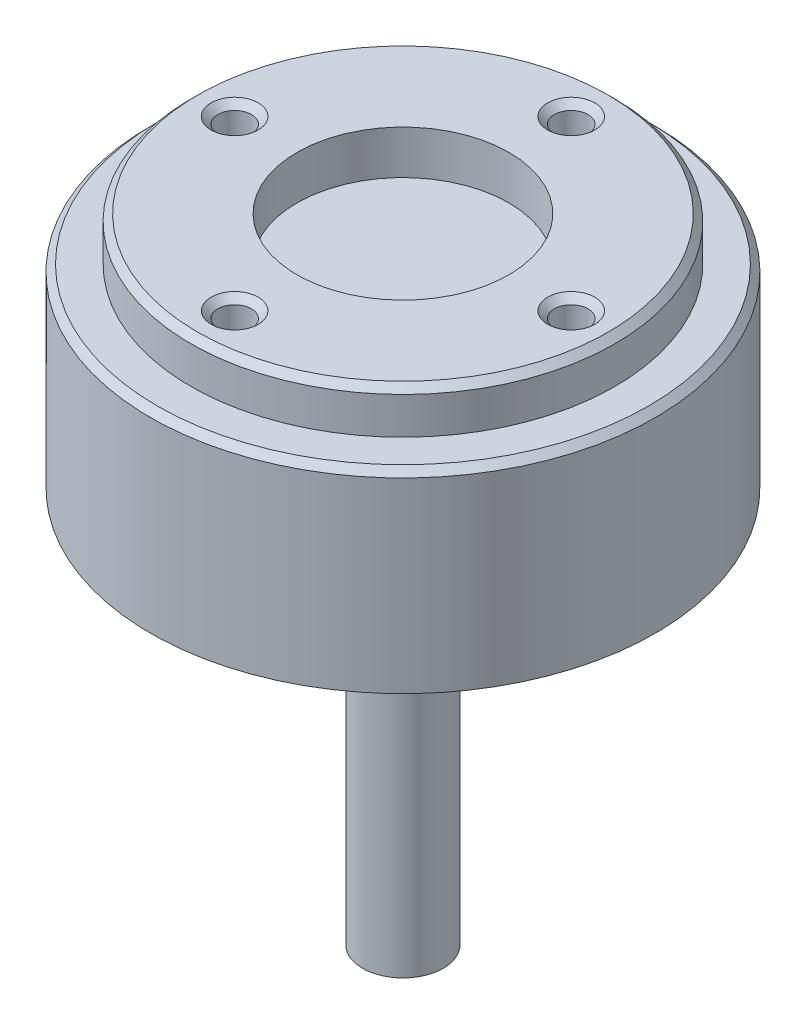
ISO-10303-21;
HEADER;
FILE_DESCRIPTION(('STEP AP214'),'2;1');
FILE_NAME('part.step','',(''),(''),'','','');
FILE_SCHEMA(('AUTOMOTIVE_DESIGN { 1 0 10303 214 1 1 1 1 }'));
ENDSEC;
DATA;
#1=APPLICATION_CONTEXT('core data for automotive mechanical design processes');
#2=APPLICATION_PROTOCOL_DEFINITION('international standard','automotive_design',2000,#1);
#3=PRODUCT_CONTEXT('',#1,'mechanical');
#4=PRODUCT('Part','Part','',(#3));
#5=PRODUCT_RELATED_PRODUCT_CATEGORY('part','',(#4));
#6=PRODUCT_DEFINITION_FORMATION('','',#4);
#7=PRODUCT_DEFINITION_CONTEXT('part definition',#1,'design');
#8=PRODUCT_DEFINITION('design','',#6,#7);
#9=PRODUCT_DEFINITION_SHAPE('','',#8);
#10=(LENGTH_UNIT() NAMED_UNIT(*) SI_UNIT(.MILLI.,.METRE.));
#11=(NAMED_UNIT(*) PLANE_ANGLE_UNIT() SI_UNIT($,.RADIAN.));
#12=(NAMED_UNIT(*) SI_UNIT($,.STERADIAN.) SOLID_ANGLE_UNIT());
#13=UNCERTAINTY_MEASURE_WITH_UNIT(LENGTH_MEASURE(1.E-05),#10,'distance_accuracy_value','');
#14=(GEOMETRIC_REPRESENTATION_CONTEXT(3) GLOBAL_UNCERTAINTY_ASSIGNED_CONTEXT((#13)) GLOBAL_UNIT_ASSIGNED_CONTEXT((#10,
#11,#12)) REPRESENTATION_CONTEXT('',''));
#15=CARTESIAN_POINT('',(0.,0.,0.));
#16=DIRECTION('',(0.,0.,1.));
#17=DIRECTION('',(1.,0.,0.));
#18=AXIS2_PLACEMENT_3D('',#15,#16,#17);
#19=CARTESIAN_POINT('',(0.,28.75,0.));
#20=DIRECTION('',(0.,-1.,0.));
#21=DIRECTION('',(0.,0.,-1.));
#22=AXIS2_PLACEMENT_3D('',#19,#20,#21);
#23=CYLINDRICAL_SURFACE('',#22,37.5);
#24=CARTESIAN_POINT('',(0.,27.7500000000001,0.));
#25=DIRECTION('',(0.,1.,0.));
#26=DIRECTION('',(0.,0.,1.));
#27=AXIS2_PLACEMENT_3D('',#24,#25,#26);
#28=CIRCLE('',#27,37.5);
#29=CARTESIAN_POINT('',(0.,27.7500000000001,-37.5));
#30=VERTEX_POINT('',#29);
#31=EDGE_CURVE('E90',#30,#30,#28,.F.);
#32=CARTESIAN_POINT('',(0.,0.,0.));
#33=DIRECTION('',(0.,1.,0.));
#34=DIRECTION('',(0.,0.,1.));
#35=AXIS2_PLACEMENT_3D('',#32,#33,#34);
#36=CIRCLE('',#35,37.5);
#37=CARTESIAN_POINT('',(0.,0.,-37.5));
#38=VERTEX_POINT('',#37);
#39=EDGE_CURVE('E120',#38,#38,#36,.T.);
#40=CARTESIAN_POINT('',(0.,27.7500000000001,-37.5));
#41=CARTESIAN_POINT('',(0.,27.4609375000001,-37.5));
#42=CARTESIAN_POINT('',(0.,27.1718750000001,-37.5));
#43=CARTESIAN_POINT('',(0.,26.5937500000001,-37.5));
#44=CARTESIAN_POINT('',(0.,26.3046875000001,-37.5));
#45=CARTESIAN_POINT('',(0.,25.7265625000001,-37.5));
#46=CARTESIAN_POINT('',(0.,25.4375000000001,-37.5));
#47=CARTESIAN_POINT('',(0.,24.8593750000001,-37.5));
#48=CARTESIAN_POINT('',(0.,24.5703125000001,-37.5));
#49=CARTESIAN_POINT('',(0.,23.9921875000001,-37.5));
#50=CARTESIAN_POINT('',(0.,23.7031250000001,-37.5));
#51=CARTESIAN_POINT('',(0.,23.1250000000001,-37.5));
#52=CARTESIAN_POINT('',(0.,22.8359375000001,-37.5));
#53=CARTESIAN_POINT('',(0.,22.2578125000001,-37.5));
#54=CARTESIAN_POINT('',(0.,21.9687500000001,-37.5));
#55=CARTESIAN_POINT('',(0.,21.3906250000001,-37.5));
#56=CARTESIAN_POINT('',(0.,21.1015625000001,-37.5));
#57=CARTESIAN_POINT('',(0.,20.5234375000001,-37.5));
#58=CARTESIAN_POINT('',(0.,20.2343750000001,-37.5));
#59=CARTESIAN_POINT('',(0.,19.6562500000001,-37.5));
#60=CARTESIAN_POINT('',(0.,19.3671875000001,-37.5));
#61=CARTESIAN_POINT('',(0.,18.7890625000001,-37.5));
#62=CARTESIAN_POINT('',(0.,18.5,-37.5));
#63=CARTESIAN_POINT('',(0.,17.921875,-37.5));
#64=CARTESIAN_POINT('',(0.,17.6328125,-37.5));
#65=CARTESIAN_POINT('',(0.,17.0546875,-37.5));
#66=CARTESIAN_POINT('',(0.,16.765625,-37.5));
#67=CARTESIAN_POINT('',(0.,16.1875,-37.5));
#68=CARTESIAN_POINT('',(0.,15.8984375,-37.5));
#69=CARTESIAN_POINT('',(0.,15.3203125,-37.5));
#70=CARTESIAN_POINT('',(0.,15.03125,-37.5));
#71=CARTESIAN_POINT('',(0.,14.453125,-37.5));
#72=CARTESIAN_POINT('',(0.,14.1640625,-37.5));
#73=CARTESIAN_POINT('',(0.,13.5859375,-37.5));
#74=CARTESIAN_POINT('',(0.,13.296875,-37.5));
#75=CARTESIAN_POINT('',(0.,12.71875,-37.5));
#76=CARTESIAN_POINT('',(0.,12.4296875,-37.5));
#77=CARTESIAN_POINT('',(0.,11.8515625,-37.5));
#78=CARTESIAN_POINT('',(0.,11.5625,-37.5));
#79=CARTESIAN_POINT('',(0.,10.984375,-37.5));
#80=CARTESIAN_POINT('',(0.,10.6953125,-37.5));
#81=CARTESIAN_POINT('',(0.,10.1171875,-37.5));
#82=CARTESIAN_POINT('',(0.,9.82812500000003,-37.5));
#83=CARTESIAN_POINT('',(0.,9.25000000000002,-37.5));
#84=CARTESIAN_POINT('',(0.,8.96093750000002,-37.5));
#85=CARTESIAN_POINT('',(0.,8.38281250000002,-37.5));
#86=CARTESIAN_POINT('',(0.,8.09375000000002,-37.5));
#87=CARTESIAN_POINT('',(0.,7.51562500000002,-37.5));
#88=CARTESIAN_POINT('',(0.,7.22656250000002,-37.5));
#89=CARTESIAN_POINT('',(0.,6.64843750000002,-37.5));
#90=CARTESIAN_POINT('',(0.,6.35937500000002,-37.5));
#91=CARTESIAN_POINT('',(0.,5.78125000000002,-37.5));
#92=CARTESIAN_POINT('',(0.,5.49218750000001,-37.5));
#93=CARTESIAN_POINT('',(0.,4.91406250000001,-37.5));
#94=CARTESIAN_POINT('',(0.,4.62500000000001,-37.5));
#95=CARTESIAN_POINT('',(0.,4.04687500000001,-37.5));
#96=CARTESIAN_POINT('',(0.,3.75781250000001,-37.5));
#97=CARTESIAN_POINT('',(0.,3.17968750000001,-37.5));
#98=CARTESIAN_POINT('',(0.,2.89062500000001,-37.5));
#99=CARTESIAN_POINT('',(0.,2.3125,-37.5));
#100=CARTESIAN_POINT('',(0.,2.0234375,-37.5));
#101=CARTESIAN_POINT('',(0.,1.4453125,-37.5));
#102=CARTESIAN_POINT('',(0.,1.15625,-37.5));
#103=CARTESIAN_POINT('',(0.,0.578124999999998,-37.5));
#104=CARTESIAN_POINT('',(0.,0.289062499999997,-37.5));
#105=CARTESIAN_POINT('',(0.,0.,-37.5));
#106=B_SPLINE_CURVE_WITH_KNOTS('',3,(#40,#41,#42,#43,#44,#45,#46,#47,#48,#49,#50,#51,#52,#53,
#54,#55,#56,#57,#58,#59,#60,#61,#62,#63,#64,#65,#66,#67,#68,#69,#70,#71,#72,#73,#74,#75,#76,#77,
#78,#79,#80,#81,#82,#83,#84,#85,#86,#87,#88,#89,#90,#91,#92,#93,#94,#95,#96,#97,#98,#99,#100,
#101,#102,#103,#104,#105),.UNSPECIFIED.,.F.,.F.,(4,2,2,2,2,2,2,2,2,2,2,2,2,2,2,2,2,2,2,2,2,2,2,
2,2,2,2,2,2,2,2,2,4),(0.,0.867187500000002,1.734375,2.6015625,3.46875000000001,4.33593750000001,
5.20312500000001,6.07031250000002,6.93750000000002,7.80468750000002,8.67187500000002,
9.53906250000002,10.40625,11.2734375,12.140625,13.0078125,13.875,14.7421875,15.609375,
16.4765625,17.34375,18.2109375000001,19.0781250000001,19.9453125000001,20.8125000000001,
21.6796875000001,22.5468750000001,23.4140625000001,24.2812500000001,25.1484375000001,
26.0156250000001,26.8828125000001,27.7500000000001),.UNSPECIFIED.);
#107=EDGE_CURVE('BSEAM49',#30,#38,#106,.T.);
#108=ORIENTED_EDGE('',*,*,#31,.T.);
#109=ORIENTED_EDGE('',*,*,#39,.T.);
#110=ORIENTED_EDGE('',*,*,#107,.T.);
#111=ORIENTED_EDGE('',*,*,#107,.F.);
#112=EDGE_LOOP('',(#108,#110,#109,#111));
#113=FACE_BOUND('',#112,.T.);
#114=ADVANCED_FACE('F49',(#113),#23,.T.);
#115=CARTESIAN_POINT('',(0.,28.75,0.));
#116=DIRECTION('',(0.,1.,0.));
#117=DIRECTION('',(0.,0.,1.));
#118=AXIS2_PLACEMENT_3D('',#115,#116,#117);
#119=PLANE('',#118);
#120=CARTESIAN_POINT('',(0.,28.75,0.));
#121=DIRECTION('',(0.,1.,0.));
#122=DIRECTION('',(0.,0.,1.));
#123=AXIS2_PLACEMENT_3D('',#120,#121,#122);
#124=CIRCLE('',#123,36.5000000000001);
#125=CARTESIAN_POINT('',(0.,28.75,36.5000000000001));
#126=VERTEX_POINT('',#125);
#127=EDGE_CURVE('E94',#126,#126,#124,.T.);
#128=ORIENTED_EDGE('',*,*,#127,.T.);
#129=EDGE_LOOP('',(#128));
#130=FACE_BOUND('',#129,.T.);
#131=CARTESIAN_POINT('',(0.,28.75,0.));
#132=DIRECTION('',(0.,1.,0.));
#133=DIRECTION('',(0.,0.,1.));
#134=AXIS2_PLACEMENT_3D('',#131,#132,#133);
#135=CIRCLE('',#134,31.5);
#136=CARTESIAN_POINT('',(0.,28.75,-31.5));
#137=VERTEX_POINT('',#136);
#138=EDGE_CURVE('E124',#137,#137,#135,.T.);
#139=ORIENTED_EDGE('',*,*,#138,.F.);
#140=EDGE_LOOP('',(#139));
#141=FACE_BOUND('',#140,.T.);
#142=ADVANCED_FACE('F174',(#130,#141),#119,.T.);
#143=CARTESIAN_POINT('',(0.,0.,0.));
#144=DIRECTION('',(0.,1.,0.));
#145=DIRECTION('',(0.,0.,1.));
#146=AXIS2_PLACEMENT_3D('',#143,#144,#145);
#147=PLANE('',#146);
#148=CARTESIAN_POINT('',(0.,0.,0.));
#149=DIRECTION('',(0.,1.,0.));
#150=DIRECTION('',(0.,0.,1.));
#151=AXIS2_PLACEMENT_3D('',#148,#149,#150);
#152=CIRCLE('',#151,7.5);
#153=CARTESIAN_POINT('',(0.,0.,7.5));
#154=VERTEX_POINT('',#153);
#155=EDGE_CURVE('E106',#154,#154,#152,.F.);
#156=ORIENTED_EDGE('',*,*,#155,.F.);
#157=EDGE_LOOP('',(#156));
#158=FACE_BOUND('',#157,.T.);
#159=ORIENTED_EDGE('',*,*,#39,.F.);
#160=EDGE_LOOP('',(#159));
#161=FACE_BOUND('',#160,.T.);
#162=ADVANCED_FACE('F181',(#158,#161),#147,.F.);
#163=CARTESIAN_POINT('',(0.,35.25,0.));
#164=DIRECTION('',(0.,1.,0.));
#165=DIRECTION('',(0.,0.,1.));
#166=AXIS2_PLACEMENT_3D('',#163,#164,#165);
#167=PLANE('',#166);
#168=CARTESIAN_POINT('',(25.,35.25,0.));
#169=DIRECTION('',(0.,1.,0.));
#170=DIRECTION('',(0.,0.,1.));
#171=AXIS2_PLACEMENT_3D('',#168,#169,#170);
#172=CIRCLE('',#171,3.50000000000002);
#173=CARTESIAN_POINT('',(25.,35.25,3.5000000000001));
#174=VERTEX_POINT('',#173);
#175=EDGE_CURVE('E68',#174,#174,#172,.F.);
#176=ORIENTED_EDGE('',*,*,#175,.T.);
#177=EDGE_LOOP('',(#176));
#178=FACE_BOUND('',#177,.T.);
#179=CARTESIAN_POINT('',(-1.74574066942157E-13,35.25,25.));
#180=DIRECTION('',(0.,1.,0.));
#181=DIRECTION('',(0.,0.,1.));
#182=AXIS2_PLACEMENT_3D('',#179,#180,#181);
#183=CIRCLE('',#182,3.50000000000002);
#184=CARTESIAN_POINT('',(-1.74574066942157E-13,35.25,28.5));
#185=VERTEX_POINT('',#184);
#186=EDGE_CURVE('E74',#185,#185,#183,.F.);
#187=ORIENTED_EDGE('',*,*,#186,.T.);
#188=EDGE_LOOP('',(#187));
#189=FACE_BOUND('',#188,.T.);
#190=CARTESIAN_POINT('',(-25.,35.25,-2.61861100413235E-13));
#191=DIRECTION('',(0.,1.,0.));
#192=DIRECTION('',(0.,0.,1.));
#193=AXIS2_PLACEMENT_3D('',#190,#191,#192);
#194=CIRCLE('',#193,3.50000000000002);
#195=CARTESIAN_POINT('',(-25.,35.25,3.49999999999975));
#196=VERTEX_POINT('',#195);
#197=EDGE_CURVE('E78',#196,#196,#194,.F.);
#198=ORIENTED_EDGE('',*,*,#197,.T.);
#199=EDGE_LOOP('',(#198));
#200=FACE_BOUND('',#199,.T.);
#201=CARTESIAN_POINT('',(0.,35.25,-25.));
#202=DIRECTION('',(0.,1.,0.));
#203=DIRECTION('',(0.,0.,1.));
#204=AXIS2_PLACEMENT_3D('',#201,#202,#203);
#205=CIRCLE('',#204,3.50000000000002);
#206=CARTESIAN_POINT('',(0.,35.25,-21.5));
#207=VERTEX_POINT('',#206);
#208=EDGE_CURVE('E82',#207,#207,#205,.F.);
#209=ORIENTED_EDGE('',*,*,#208,.T.);
#210=EDGE_LOOP('',(#209));
#211=FACE_BOUND('',#210,.T.);
#212=CARTESIAN_POINT('',(0.,35.25,0.));
#213=DIRECTION('',(0.,1.,0.));
#214=DIRECTION('',(0.,0.,1.));
#215=AXIS2_PLACEMENT_3D('',#212,#213,#214);
#216=CIRCLE('',#215,30.5000000000001);
#217=CARTESIAN_POINT('',(0.,35.25,30.5000000000001));
#218=VERTEX_POINT('',#217);
#219=EDGE_CURVE('E102',#218,#218,#216,.T.);
#220=ORIENTED_EDGE('',*,*,#219,.T.);
#221=EDGE_LOOP('',(#220));
#222=FACE_BOUND('',#221,.T.);
#223=CARTESIAN_POINT('',(0.,35.25,0.));
#224=DIRECTION('',(0.,1.,0.));
#225=DIRECTION('',(0.,0.,1.));
#226=AXIS2_PLACEMENT_3D('',#223,#224,#225);
#227=CIRCLE('',#226,15.75);
#228=CARTESIAN_POINT('',(0.,35.25,-15.75));
#229=VERTEX_POINT('',#228);
#230=EDGE_CURVE('E128',#229,#229,#227,.T.);
#231=ORIENTED_EDGE('',*,*,#230,.F.);
#232=EDGE_LOOP('',(#231));
#233=FACE_BOUND('',#232,.T.);
#234=ADVANCED_FACE('F229',(#178,#189,#200,#211,#222,#233),#167,.T.);
#235=CARTESIAN_POINT('',(0.,35.25,0.));
#236=DIRECTION('',(0.,-1.,0.));
#237=DIRECTION('',(0.,0.,-1.));
#238=AXIS2_PLACEMENT_3D('',#235,#236,#237);
#239=CYLINDRICAL_SURFACE('',#238,31.5);
#240=CARTESIAN_POINT('',(0.,34.2500000000001,0.));
#241=DIRECTION('',(0.,1.,0.));
#242=DIRECTION('',(0.,0.,1.));
#243=AXIS2_PLACEMENT_3D('',#240,#241,#242);
#244=CIRCLE('',#243,31.5);
#245=CARTESIAN_POINT('',(0.,34.2500000000001,-31.5));
#246=VERTEX_POINT('',#245);
#247=EDGE_CURVE('E98',#246,#246,#244,.F.);
#248=CARTESIAN_POINT('',(0.,34.2500000000001,-31.5));
#249=CARTESIAN_POINT('',(0.,34.1927083333334,-31.5));
#250=CARTESIAN_POINT('',(0.,34.1354166666667,-31.5));
#251=CARTESIAN_POINT('',(0.,34.0208333333334,-31.5));
#252=CARTESIAN_POINT('',(0.,33.9635416666667,-31.5));
#253=CARTESIAN_POINT('',(0.,33.8489583333334,-31.5));
#254=CARTESIAN_POINT('',(0.,33.7916666666667,-31.5));
#255=CARTESIAN_POINT('',(0.,33.6770833333334,-31.5));
#256=CARTESIAN_POINT('',(0.,33.6197916666667,-31.5));
#257=CARTESIAN_POINT('',(0.,33.5052083333334,-31.5));
#258=CARTESIAN_POINT('',(0.,33.4479166666667,-31.5));
#259=CARTESIAN_POINT('',(0.,33.3333333333334,-31.5));
#260=CARTESIAN_POINT('',(0.,33.2760416666667,-31.5));
#261=CARTESIAN_POINT('',(0.,33.1614583333334,-31.5));
#262=CARTESIAN_POINT('',(0.,33.1041666666667,-31.5));
#263=CARTESIAN_POINT('',(0.,32.9895833333334,-31.5));
#264=CARTESIAN_POINT('',(0.,32.9322916666667,-31.5));
#265=CARTESIAN_POINT('',(0.,32.8177083333334,-31.5));
#266=CARTESIAN_POINT('',(0.,32.7604166666667,-31.5));
#267=CARTESIAN_POINT('',(0.,32.6458333333334,-31.5));
#268=CARTESIAN_POINT('',(0.,32.5885416666667,-31.5));
#269=CARTESIAN_POINT('',(0.,32.4739583333334,-31.5));
#270=CARTESIAN_POINT('',(0.,32.4166666666667,-31.5));
#271=CARTESIAN_POINT('',(0.,32.3020833333334,-31.5));
#272=CARTESIAN_POINT('',(0.,32.2447916666667,-31.5));
#273=CARTESIAN_POINT('',(0.,32.1302083333334,-31.5));
#274=CARTESIAN_POINT('',(0.,32.0729166666667,-31.5));
#275=CARTESIAN_POINT('',(0.,31.9583333333334,-31.5));
#276=CARTESIAN_POINT('',(0.,31.9010416666667,-31.5));
#277=CARTESIAN_POINT('',(0.,31.7864583333334,-31.5));
#278=CARTESIAN_POINT('',(0.,31.7291666666667,-31.5));
#279=CARTESIAN_POINT('',(0.,31.6145833333334,-31.5));
#280=CARTESIAN_POINT('',(0.,31.5572916666667,-31.5));
#281=CARTESIAN_POINT('',(0.,31.4427083333334,-31.5));
#282=CARTESIAN_POINT('',(0.,31.3854166666667,-31.5));
#283=CARTESIAN_POINT('',(0.,31.2708333333334,-31.5));
#284=CARTESIAN_POINT('',(0.,31.2135416666667,-31.5));
#285=CARTESIAN_POINT('',(0.,31.0989583333334,-31.5));
#286=CARTESIAN_POINT('',(0.,31.0416666666667,-31.5));
#287=CARTESIAN_POINT('',(0.,30.9270833333334,-31.5));
#288=CARTESIAN_POINT('',(0.,30.8697916666667,-31.5));
#289=CARTESIAN_POINT('',(0.,30.7552083333334,-31.5));
#290=CARTESIAN_POINT('',(0.,30.6979166666667,-31.5));
#291=CARTESIAN_POINT('',(0.,30.5833333333334,-31.5));
#292=CARTESIAN_POINT('',(0.,30.5260416666667,-31.5));
#293=CARTESIAN_POINT('',(0.,30.4114583333334,-31.5));
#294=CARTESIAN_POINT('',(0.,30.3541666666667,-31.5));
#295=CARTESIAN_POINT('',(0.,30.2395833333334,-31.5));
#296=CARTESIAN_POINT('',(0.,30.1822916666667,-31.5));
#297=CARTESIAN_POINT('',(0.,30.0677083333334,-31.5));
#298=CARTESIAN_POINT('',(0.,30.0104166666667,-31.5));
#299=CARTESIAN_POINT('',(0.,29.8958333333333,-31.5));
#300=CARTESIAN_POINT('',(0.,29.8385416666667,-31.5));
#301=CARTESIAN_POINT('',(0.,29.7239583333333,-31.5));
#302=CARTESIAN_POINT('',(0.,29.6666666666667,-31.5));
#303=CARTESIAN_POINT('',(0.,29.5520833333333,-31.5));
#304=CARTESIAN_POINT('',(0.,29.4947916666667,-31.5));
#305=CARTESIAN_POINT('',(0.,29.3802083333333,-31.5));
#306=CARTESIAN_POINT('',(0.,29.3229166666667,-31.5));
#307=CARTESIAN_POINT('',(0.,29.2083333333333,-31.5));
#308=CARTESIAN_POINT('',(0.,29.1510416666667,-31.5));
#309=CARTESIAN_POINT('',(0.,29.0364583333333,-31.5));
#310=CARTESIAN_POINT('',(0.,28.9791666666667,-31.5));
#311=CARTESIAN_POINT('',(0.,28.8645833333333,-31.5));
#312=CARTESIAN_POINT('',(0.,28.8072916666667,-31.5));
#313=CARTESIAN_POINT('',(0.,28.75,-31.5));
#314=B_SPLINE_CURVE_WITH_KNOTS('',3,(#248,#249,#250,#251,#252,#253,#254,#255,#256,#257,#258,
#259,#260,#261,#262,#263,#264,#265,#266,#267,#268,#269,#270,#271,#272,#273,#274,#275,#276,#277,
#278,#279,#280,#281,#282,#283,#284,#285,#286,#287,#288,#289,#290,#291,#292,#293,#294,#295,#296,
#297,#298,#299,#300,#301,#302,#303,#304,#305,#306,#307,#308,#309,#310,#311,#312,#313),
.UNSPECIFIED.,.F.,.F.,(4,2,2,2,2,2,2,2,2,2,2,2,2,2,2,2,2,2,2,2,2,2,2,2,2,2,2,2,2,2,2,2,4),(0.,
0.171875000000002,0.343750000000004,0.515625000000006,0.687500000000008,0.859375000000009,
1.03125000000001,1.20312500000001,1.37500000000002,1.54687500000002,1.71875000000002,
1.89062500000003,2.06250000000003,2.23437500000003,2.40625000000003,2.57812500000004,
2.75000000000004,2.92187500000004,3.09375000000004,3.26562500000004,3.43750000000005,
3.60937500000005,3.78125000000005,3.95312500000005,4.12500000000006,4.29687500000006,
4.46875000000006,4.64062500000006,4.81250000000007,4.98437500000007,5.15625000000007,
5.32812500000008,5.50000000000008),.UNSPECIFIED.);
#315=EDGE_CURVE('BSEAM232',#246,#137,#314,.T.);
#316=ORIENTED_EDGE('',*,*,#247,.T.);
#317=ORIENTED_EDGE('',*,*,#138,.T.);
#318=ORIENTED_EDGE('',*,*,#315,.T.);
#319=ORIENTED_EDGE('',*,*,#315,.F.);
#320=EDGE_LOOP('',(#316,#318,#317,#319));
#321=FACE_BOUND('',#320,.T.);
#322=ADVANCED_FACE('F232',(#321),#239,.T.);
#323=CARTESIAN_POINT('',(0.,35.25,0.));
#324=DIRECTION('',(0.,-1.,0.));
#325=DIRECTION('',(0.,0.,-1.));
#326=AXIS2_PLACEMENT_3D('',#323,#324,#325);
#327=CYLINDRICAL_SURFACE('',#326,15.75);
#328=CARTESIAN_POINT('',(0.,28.75,0.));
#329=DIRECTION('',(0.,1.,0.));
#330=DIRECTION('',(0.,0.,1.));
#331=AXIS2_PLACEMENT_3D('',#328,#329,#330);
#332=CIRCLE('',#331,15.75);
#333=CARTESIAN_POINT('',(0.,28.75,-15.75));
#334=VERTEX_POINT('',#333);
#335=EDGE_CURVE('E110',#334,#334,#332,.F.);
#336=CARTESIAN_POINT('',(0.,35.25,-15.75));
#337=CARTESIAN_POINT('',(0.,35.1822916666667,-15.75));
#338=CARTESIAN_POINT('',(0.,35.1145833333333,-15.75));
#339=CARTESIAN_POINT('',(0.,34.9791666666667,-15.75));
#340=CARTESIAN_POINT('',(0.,34.9114583333333,-15.75));
#341=CARTESIAN_POINT('',(0.,34.7760416666667,-15.75));
#342=CARTESIAN_POINT('',(0.,34.7083333333333,-15.75));
#343=CARTESIAN_POINT('',(0.,34.5729166666667,-15.75));
#344=CARTESIAN_POINT('',(0.,34.5052083333333,-15.75));
#345=CARTESIAN_POINT('',(0.,34.3697916666667,-15.75));
#346=CARTESIAN_POINT('',(0.,34.3020833333333,-15.75));
#347=CARTESIAN_POINT('',(0.,34.1666666666667,-15.75));
#348=CARTESIAN_POINT('',(0.,34.0989583333333,-15.75));
#349=CARTESIAN_POINT('',(0.,33.9635416666667,-15.75));
#350=CARTESIAN_POINT('',(0.,33.8958333333333,-15.75));
#351=CARTESIAN_POINT('',(0.,33.7604166666667,-15.75));
#352=CARTESIAN_POINT('',(0.,33.6927083333333,-15.75));
#353=CARTESIAN_POINT('',(0.,33.5572916666667,-15.75));
#354=CARTESIAN_POINT('',(0.,33.4895833333333,-15.75));
#355=CARTESIAN_POINT('',(0.,33.3541666666667,-15.75));
#356=CARTESIAN_POINT('',(0.,33.2864583333333,-15.75));
#357=CARTESIAN_POINT('',(0.,33.1510416666667,-15.75));
#358=CARTESIAN_POINT('',(0.,33.0833333333333,-15.75));
#359=CARTESIAN_POINT('',(0.,32.9479166666667,-15.75));
#360=CARTESIAN_POINT('',(0.,32.8802083333333,-15.75));
#361=CARTESIAN_POINT('',(0.,32.7447916666667,-15.75));
#362=CARTESIAN_POINT('',(0.,32.6770833333333,-15.75));
#363=CARTESIAN_POINT('',(0.,32.5416666666667,-15.75));
#364=CARTESIAN_POINT('',(0.,32.4739583333333,-15.75));
#365=CARTESIAN_POINT('',(0.,32.3385416666667,-15.75));
#366=CARTESIAN_POINT('',(0.,32.2708333333333,-15.75));
#367=CARTESIAN_POINT('',(0.,32.1354166666667,-15.75));
#368=CARTESIAN_POINT('',(0.,32.0677083333333,-15.75));
#369=CARTESIAN_POINT('',(0.,31.9322916666667,-15.75));
#370=CARTESIAN_POINT('',(0.,31.8645833333333,-15.75));
#371=CARTESIAN_POINT('',(0.,31.7291666666667,-15.75));
#372=CARTESIAN_POINT('',(0.,31.6614583333333,-15.75));
#373=CARTESIAN_POINT('',(0.,31.5260416666667,-15.75));
#374=CARTESIAN_POINT('',(0.,31.4583333333333,-15.75));
#375=CARTESIAN_POINT('',(0.,31.3229166666667,-15.75));
#376=CARTESIAN_POINT('',(0.,31.2552083333333,-15.75));
#377=CARTESIAN_POINT('',(0.,31.1197916666667,-15.75));
#378=CARTESIAN_POINT('',(0.,31.0520833333333,-15.75));
#379=CARTESIAN_POINT('',(0.,30.9166666666667,-15.75));
#380=CARTESIAN_POINT('',(0.,30.8489583333333,-15.75));
#381=CARTESIAN_POINT('',(0.,30.7135416666667,-15.75));
#382=CARTESIAN_POINT('',(0.,30.6458333333333,-15.75));
#383=CARTESIAN_POINT('',(0.,30.5104166666667,-15.75));
#384=CARTESIAN_POINT('',(0.,30.4427083333333,-15.75));
#385=CARTESIAN_POINT('',(0.,30.3072916666667,-15.75));
#386=CARTESIAN_POINT('',(0.,30.2395833333333,-15.75));
#387=CARTESIAN_POINT('',(0.,30.1041666666667,-15.75));
#388=CARTESIAN_POINT('',(0.,30.0364583333333,-15.75));
#389=CARTESIAN_POINT('',(0.,29.9010416666667,-15.75));
#390=CARTESIAN_POINT('',(0.,29.8333333333333,-15.75));
#391=CARTESIAN_POINT('',(0.,29.6979166666667,-15.75));
#392=CARTESIAN_POINT('',(0.,29.6302083333333,-15.75));
#393=CARTESIAN_POINT('',(0.,29.4947916666667,-15.75));
#394=CARTESIAN_POINT('',(0.,29.4270833333333,-15.75));
#395=CARTESIAN_POINT('',(0.,29.2916666666667,-15.75));
#396=CARTESIAN_POINT('',(0.,29.2239583333333,-15.75));
#397=CARTESIAN_POINT('',(0.,29.0885416666667,-15.75));
#398=CARTESIAN_POINT('',(0.,29.0208333333333,-15.75));
#399=CARTESIAN_POINT('',(0.,28.8854166666667,-15.75));
#400=CARTESIAN_POINT('',(0.,28.8177083333333,-15.75));
#401=CARTESIAN_POINT('',(0.,28.75,-15.75));
#402=B_SPLINE_CURVE_WITH_KNOTS('',3,(#336,#337,#338,#339,#340,#341,#342,#343,#344,#345,#346,
#347,#348,#349,#350,#351,#352,#353,#354,#355,#356,#357,#358,#359,#360,#361,#362,#363,#364,#365,
#366,#367,#368,#369,#370,#371,#372,#373,#374,#375,#376,#377,#378,#379,#380,#381,#382,#383,#384,
#385,#386,#387,#388,#389,#390,#391,#392,#393,#394,#395,#396,#397,#398,#399,#400,#401),
.UNSPECIFIED.,.F.,.F.,(4,2,2,2,2,2,2,2,2,2,2,2,2,2,2,2,2,2,2,2,2,2,2,2,2,2,2,2,2,2,2,2,4),(0.,
0.203124999999998,0.406249999999997,0.609374999999995,0.812499999999994,1.015625,1.21875,
1.421875,1.62499999999999,1.82812499999999,2.03125,2.234375,2.4375,2.64062499999999,2.84375,
3.046875,3.25,3.45312499999999,3.65624999999999,3.859375,4.0625,4.26562499999999,
4.46874999999999,4.671875,4.87499999999999,5.078125,5.28124999999999,5.48437499999999,
5.68749999999999,5.890625,6.09374999999999,6.29687499999999,6.5),.UNSPECIFIED.);
#403=EDGE_CURVE('BSEAM241',#229,#334,#402,.T.);
#404=ORIENTED_EDGE('',*,*,#230,.T.);
#405=ORIENTED_EDGE('',*,*,#335,.T.);
#406=ORIENTED_EDGE('',*,*,#403,.T.);
#407=ORIENTED_EDGE('',*,*,#403,.F.);
#408=EDGE_LOOP('',(#404,#406,#405,#407));
#409=FACE_BOUND('',#408,.T.);
#410=ADVANCED_FACE('F241',(#409),#327,.F.);
#411=ORIENTED_EDGE('',*,*,#335,.F.);
#412=EDGE_LOOP('',(#411));
#413=FACE_BOUND('',#412,.T.);
#414=ADVANCED_FACE('F184',(#413),#119,.T.);
#415=CARTESIAN_POINT('',(0.,-4.7,0.));
#416=DIRECTION('',(0.,1.,0.));
#417=DIRECTION('',(0.,0.,1.));
#418=AXIS2_PLACEMENT_3D('',#415,#416,#417);
#419=CYLINDRICAL_SURFACE('',#418,7.5);
#420=CARTESIAN_POINT('',(0.,-4.7,0.));
#421=DIRECTION('',(0.,-1.,0.));
#422=DIRECTION('',(0.,0.,-1.));
#423=AXIS2_PLACEMENT_3D('',#420,#421,#422);
#424=CIRCLE('',#423,7.5);
#425=CARTESIAN_POINT('',(0.,-4.7,-7.5));
#426=VERTEX_POINT('',#425);
#427=EDGE_CURVE('E116',#426,#426,#424,.T.);
#428=ORIENTED_EDGE('',*,*,#427,.F.);
#429=EDGE_LOOP('',(#428));
#430=FACE_BOUND('',#429,.T.);
#431=ORIENTED_EDGE('',*,*,#155,.T.);
#432=EDGE_LOOP('',(#431));
#433=FACE_BOUND('',#432,.T.);
#434=ADVANCED_FACE('F248',(#430,#433),#419,.T.);
#435=CARTESIAN_POINT('',(0.,-4.7,0.));
#436=DIRECTION('',(0.,-1.,0.));
#437=DIRECTION('',(0.,0.,-1.));
#438=AXIS2_PLACEMENT_3D('',#435,#436,#437);
#439=PLANE('',#438);
#440=CARTESIAN_POINT('',(0.,-4.7,0.));
#441=DIRECTION('',(0.,-1.,0.));
#442=DIRECTION('',(0.,0.,-1.));
#443=AXIS2_PLACEMENT_3D('',#440,#441,#442);
#444=CIRCLE('',#443,6.);
#445=CARTESIAN_POINT('',(0.,-4.7,-6.));
#446=VERTEX_POINT('',#445);
#447=EDGE_CURVE('E111',#446,#446,#444,.T.);
#448=ORIENTED_EDGE('',*,*,#447,.F.);
#449=EDGE_LOOP('',(#448));
#450=FACE_BOUND('',#449,.T.);
#451=ORIENTED_EDGE('',*,*,#427,.T.);
#452=EDGE_LOOP('',(#451));
#453=FACE_BOUND('',#452,.T.);
#454=ADVANCED_FACE('F253',(#450,#453),#439,.T.);
#455=CARTESIAN_POINT('',(0.,-58.85,0.));
#456=DIRECTION('',(0.,-1.,0.));
#457=DIRECTION('',(0.,0.,-1.));
#458=AXIS2_PLACEMENT_3D('',#455,#456,#457);
#459=PLANE('',#458);
#460=CARTESIAN_POINT('',(0.,-58.85,0.));
#461=DIRECTION('',(0.,-1.,0.));
#462=DIRECTION('',(0.,0.,-1.));
#463=AXIS2_PLACEMENT_3D('',#460,#461,#462);
#464=CIRCLE('',#463,6.);
#465=CARTESIAN_POINT('',(0.,-58.85,-6.));
#466=VERTEX_POINT('',#465);
#467=EDGE_CURVE('E115',#466,#466,#464,.T.);
#468=ORIENTED_EDGE('',*,*,#467,.T.);
#469=EDGE_LOOP('',(#468));
#470=FACE_BOUND('',#469,.T.);
#471=ADVANCED_FACE('F261',(#470),#459,.T.);
#472=CARTESIAN_POINT('',(0.,-58.85,0.));
#473=DIRECTION('',(0.,1.,0.));
#474=DIRECTION('',(0.,0.,1.));
#475=AXIS2_PLACEMENT_3D('',#472,#473,#474);
#476=CYLINDRICAL_SURFACE('',#475,6.);
#477=ORIENTED_EDGE('',*,*,#447,.T.);
#478=EDGE_LOOP('',(#477));
#479=FACE_BOUND('',#478,.T.);
#480=ORIENTED_EDGE('',*,*,#467,.F.);
#481=EDGE_LOOP('',(#480));
#482=FACE_BOUND('',#481,.T.);
#483=ADVANCED_FACE('F196',(#479,#482),#476,.T.);
#484=CARTESIAN_POINT('',(0.,35.25,0.));
#485=DIRECTION('',(0.,-1.,0.));
#486=DIRECTION('',(0.,0.,-1.));
#487=AXIS2_PLACEMENT_3D('',#484,#485,#486);
#488=CONICAL_SURFACE('',#487,30.5000000000001,0.785398163397445);
#489=ORIENTED_EDGE('',*,*,#247,.F.);
#490=EDGE_LOOP('',(#489));
#491=FACE_BOUND('',#490,.T.);
#492=ORIENTED_EDGE('',*,*,#219,.F.);
#493=EDGE_LOOP('',(#492));
#494=FACE_BOUND('',#493,.T.);
#495=ADVANCED_FACE('F189',(#491,#494),#488,.T.);
#496=CARTESIAN_POINT('',(0.,28.75,0.));
#497=DIRECTION('',(0.,-1.,0.));
#498=DIRECTION('',(0.,0.,-1.));
#499=AXIS2_PLACEMENT_3D('',#496,#497,#498);
#500=CONICAL_SURFACE('',#499,36.5000000000001,0.785398163397441);
#501=ORIENTED_EDGE('',*,*,#31,.F.);
#502=EDGE_LOOP('',(#501));
#503=FACE_BOUND('',#502,.T.);
#504=ORIENTED_EDGE('',*,*,#127,.F.);
#505=EDGE_LOOP('',(#504));
#506=FACE_BOUND('',#505,.T.);
#507=ADVANCED_FACE('F195',(#503,#506),#500,.T.);
#508=CARTESIAN_POINT('',(-25.,27.25,-2.61861100413235E-13));
#509=DIRECTION('',(0.,1.,0.));
#510=DIRECTION('',(0.,0.,1.));
#511=AXIS2_PLACEMENT_3D('',#508,#509,#510);
#512=CYLINDRICAL_SURFACE('',#511,2.5);
#513=CARTESIAN_POINT('',(-25.,34.25,-2.61861100413235E-13));
#514=DIRECTION('',(0.,1.,0.));
#515=DIRECTION('',(0.,0.,1.));
#516=AXIS2_PLACEMENT_3D('',#513,#514,#515);
#517=CIRCLE('',#516,2.5);
#518=CARTESIAN_POINT('',(-25.,34.25,2.49999999999974));
#519=VERTEX_POINT('',#518);
#520=EDGE_CURVE('E58',#519,#519,#517,.T.);
#521=ORIENTED_EDGE('',*,*,#520,.T.);
#522=EDGE_LOOP('',(#521));
#523=FACE_BOUND('',#522,.T.);
#524=CARTESIAN_POINT('',(-25.,27.25,-2.61861100413235E-13));
#525=DIRECTION('',(0.,1.,0.));
#526=DIRECTION('',(0.,0.,1.));
#527=AXIS2_PLACEMENT_3D('',#524,#525,#526);
#528=CIRCLE('',#527,2.5);
#529=CARTESIAN_POINT('',(-25.,27.25,2.49999999999974));
#530=VERTEX_POINT('',#529);
#531=EDGE_CURVE('E139',#530,#530,#528,.T.);
#532=ORIENTED_EDGE('',*,*,#531,.F.);
#533=EDGE_LOOP('',(#532));
#534=FACE_BOUND('',#533,.T.);
#535=ADVANCED_FACE('F203',(#523,#534),#512,.F.);
#536=CARTESIAN_POINT('',(-25.,27.25,-2.61861100413235E-13));
#537=DIRECTION('',(0.,1.,0.));
#538=DIRECTION('',(0.,0.,1.));
#539=AXIS2_PLACEMENT_3D('',#536,#537,#538);
#540=PLANE('',#539);
#541=ORIENTED_EDGE('',*,*,#531,.T.);
#542=EDGE_LOOP('',(#541));
#543=FACE_BOUND('',#542,.T.);
#544=ADVANCED_FACE('F268',(#543),#540,.T.);
#545=CARTESIAN_POINT('',(-1.74574066942157E-13,27.25,25.));
#546=DIRECTION('',(0.,1.,0.));
#547=DIRECTION('',(0.,0.,1.));
#548=AXIS2_PLACEMENT_3D('',#545,#546,#547);
#549=CYLINDRICAL_SURFACE('',#548,2.5);
#550=CARTESIAN_POINT('',(-1.74574066942157E-13,34.25,25.));
#551=DIRECTION('',(0.,1.,0.));
#552=DIRECTION('',(0.,0.,1.));
#553=AXIS2_PLACEMENT_3D('',#550,#551,#552);
#554=CIRCLE('',#553,2.5);
#555=CARTESIAN_POINT('',(-1.74574066942157E-13,34.25,27.5));
#556=VERTEX_POINT('',#555);
#557=EDGE_CURVE('E63',#556,#556,#554,.T.);
#558=ORIENTED_EDGE('',*,*,#557,.T.);
#559=EDGE_LOOP('',(#558));
#560=FACE_BOUND('',#559,.T.);
#561=CARTESIAN_POINT('',(-1.74574066942157E-13,27.25,25.));
#562=DIRECTION('',(0.,1.,0.));
#563=DIRECTION('',(0.,0.,1.));
#564=AXIS2_PLACEMENT_3D('',#561,#562,#563);
#565=CIRCLE('',#564,2.5);
#566=CARTESIAN_POINT('',(-1.74574066942157E-13,27.25,27.5));
#567=VERTEX_POINT('',#566);
#568=EDGE_CURVE('E143',#567,#567,#565,.T.);
#569=ORIENTED_EDGE('',*,*,#568,.F.);
#570=EDGE_LOOP('',(#569));
#571=FACE_BOUND('',#570,.T.);
#572=ADVANCED_FACE('F271',(#560,#571),#549,.F.);
#573=CARTESIAN_POINT('',(-1.74574066942157E-13,27.25,25.));
#574=DIRECTION('',(0.,1.,0.));
#575=DIRECTION('',(0.,0.,1.));
#576=AXIS2_PLACEMENT_3D('',#573,#574,#575);
#577=PLANE('',#576);
#578=ORIENTED_EDGE('',*,*,#568,.T.);
#579=EDGE_LOOP('',(#578));
#580=FACE_BOUND('',#579,.T.);
#581=ADVANCED_FACE('F275',(#580),#577,.T.);
#582=CARTESIAN_POINT('',(25.,27.25,0.));
#583=DIRECTION('',(0.,1.,0.));
#584=DIRECTION('',(0.,0.,1.));
#585=AXIS2_PLACEMENT_3D('',#582,#583,#584);
#586=CYLINDRICAL_SURFACE('',#585,2.5);
#587=CARTESIAN_POINT('',(25.,34.25,0.));
#588=DIRECTION('',(0.,1.,0.));
#589=DIRECTION('',(0.,0.,1.));
#590=AXIS2_PLACEMENT_3D('',#587,#588,#589);
#591=CIRCLE('',#590,2.5);
#592=CARTESIAN_POINT('',(25.,34.25,2.50000000000009));
#593=VERTEX_POINT('',#592);
#594=EDGE_CURVE('E86',#593,#593,#591,.T.);
#595=ORIENTED_EDGE('',*,*,#594,.T.);
#596=EDGE_LOOP('',(#595));
#597=FACE_BOUND('',#596,.T.);
#598=CARTESIAN_POINT('',(25.,27.25,0.));
#599=DIRECTION('',(0.,1.,0.));
#600=DIRECTION('',(0.,0.,1.));
#601=AXIS2_PLACEMENT_3D('',#598,#599,#600);
#602=CIRCLE('',#601,2.5);
#603=CARTESIAN_POINT('',(25.,27.25,2.50000000000009));
#604=VERTEX_POINT('',#603);
#605=EDGE_CURVE('E147',#604,#604,#602,.T.);
#606=ORIENTED_EDGE('',*,*,#605,.F.);
#607=EDGE_LOOP('',(#606));
#608=FACE_BOUND('',#607,.T.);
#609=ADVANCED_FACE('F169',(#597,#608),#586,.F.);
#610=CARTESIAN_POINT('',(25.,27.25,0.));
#611=DIRECTION('',(0.,1.,0.));
#612=DIRECTION('',(0.,0.,1.));
#613=AXIS2_PLACEMENT_3D('',#610,#611,#612);
#614=PLANE('',#613);
#615=ORIENTED_EDGE('',*,*,#605,.T.);
#616=EDGE_LOOP('',(#615));
#617=FACE_BOUND('',#616,.T.);
#618=ADVANCED_FACE('F159',(#617),#614,.T.);
#619=CARTESIAN_POINT('',(0.,27.25,-25.));
#620=DIRECTION('',(0.,1.,0.));
#621=DIRECTION('',(0.,0.,1.));
#622=AXIS2_PLACEMENT_3D('',#619,#620,#621);
#623=CYLINDRICAL_SURFACE('',#622,2.5);
#624=CARTESIAN_POINT('',(0.,34.25,-25.));
#625=DIRECTION('',(0.,1.,0.));
#626=DIRECTION('',(0.,0.,1.));
#627=AXIS2_PLACEMENT_3D('',#624,#625,#626);
#628=CIRCLE('',#627,2.5);
#629=CARTESIAN_POINT('',(0.,34.25,-22.5));
#630=VERTEX_POINT('',#629);
#631=EDGE_CURVE('E10',#630,#630,#628,.T.);
#632=ORIENTED_EDGE('',*,*,#631,.T.);
#633=EDGE_LOOP('',(#632));
#634=FACE_BOUND('',#633,.T.);
#635=CARTESIAN_POINT('',(0.,27.25,-25.));
#636=DIRECTION('',(0.,1.,0.));
#637=DIRECTION('',(0.,0.,1.));
#638=AXIS2_PLACEMENT_3D('',#635,#636,#637);
#639=CIRCLE('',#638,2.5);
#640=CARTESIAN_POINT('',(0.,27.25,-22.5));
#641=VERTEX_POINT('',#640);
#642=EDGE_CURVE('E138',#641,#641,#639,.T.);
#643=ORIENTED_EDGE('',*,*,#642,.F.);
#644=EDGE_LOOP('',(#643));
#645=FACE_BOUND('',#644,.T.);
#646=ADVANCED_FACE('F157',(#634,#645),#623,.F.);
#647=CARTESIAN_POINT('',(0.,27.25,-25.));
#648=DIRECTION('',(0.,1.,0.));
#649=DIRECTION('',(0.,0.,1.));
#650=AXIS2_PLACEMENT_3D('',#647,#648,#649);
#651=PLANE('',#650);
#652=ORIENTED_EDGE('',*,*,#642,.T.);
#653=EDGE_LOOP('',(#652));
#654=FACE_BOUND('',#653,.T.);
#655=ADVANCED_FACE('F155',(#654),#651,.T.);
#656=CARTESIAN_POINT('',(25.,34.25,0.));
#657=DIRECTION('',(0.,1.,0.));
#658=DIRECTION('',(0.,0.,1.));
#659=AXIS2_PLACEMENT_3D('',#656,#657,#658);
#660=CONICAL_SURFACE('',#659,2.5,0.785398163397463);
#661=ORIENTED_EDGE('',*,*,#175,.F.);
#662=EDGE_LOOP('',(#661));
#663=FACE_BOUND('',#662,.T.);
#664=ORIENTED_EDGE('',*,*,#594,.F.);
#665=EDGE_LOOP('',(#664));
#666=FACE_BOUND('',#665,.T.);
#667=ADVANCED_FACE('F166',(#663,#666),#660,.F.);
#668=CARTESIAN_POINT('',(-1.74574066942157E-13,34.25,25.));
#669=DIRECTION('',(0.,1.,0.));
#670=DIRECTION('',(0.,0.,1.));
#671=AXIS2_PLACEMENT_3D('',#668,#669,#670);
#672=CONICAL_SURFACE('',#671,2.5,0.785398163397464);
#673=ORIENTED_EDGE('',*,*,#186,.F.);
#674=EDGE_LOOP('',(#673));
#675=FACE_BOUND('',#674,.T.);
#676=ORIENTED_EDGE('',*,*,#557,.F.);
#677=EDGE_LOOP('',(#676));
#678=FACE_BOUND('',#677,.T.);
#679=ADVANCED_FACE('F210',(#675,#678),#672,.F.);
#680=CARTESIAN_POINT('',(-25.,34.25,-2.61861100413235E-13));
#681=DIRECTION('',(0.,1.,0.));
#682=DIRECTION('',(0.,0.,1.));
#683=AXIS2_PLACEMENT_3D('',#680,#681,#682);
#684=CONICAL_SURFACE('',#683,2.5,0.785398163397463);
#685=ORIENTED_EDGE('',*,*,#197,.F.);
#686=EDGE_LOOP('',(#685));
#687=FACE_BOUND('',#686,.T.);
#688=ORIENTED_EDGE('',*,*,#520,.F.);
#689=EDGE_LOOP('',(#688));
#690=FACE_BOUND('',#689,.T.);
#691=ADVANCED_FACE('F216',(#687,#690),#684,.F.);
#692=CARTESIAN_POINT('',(0.,34.25,-25.));
#693=DIRECTION('',(0.,1.,0.));
#694=DIRECTION('',(0.,0.,1.));
#695=AXIS2_PLACEMENT_3D('',#692,#693,#694);
#696=CONICAL_SURFACE('',#695,2.5,0.785398163397463);
#697=ORIENTED_EDGE('',*,*,#208,.F.);
#698=EDGE_LOOP('',(#697));
#699=FACE_BOUND('',#698,.T.);
#700=ORIENTED_EDGE('',*,*,#631,.F.);
#701=EDGE_LOOP('',(#700));
#702=FACE_BOUND('',#701,.T.);
#703=ADVANCED_FACE('F52',(#699,#702),#696,.F.);
#704=CLOSED_SHELL('',(#114,#142,#162,#234,#322,#410,#414,#434,#454,#471,#483,#495,#507,#535,
#544,#572,#581,#609,#618,#646,#655,#667,#679,#691,#703));
#705=MANIFOLD_SOLID_BREP('B2',#704);
#706=ADVANCED_BREP_SHAPE_REPRESENTATION('',(#18,#705),#14);
#707=SHAPE_DEFINITION_REPRESENTATION(#9,#706);
ENDSEC;
END-ISO-10303-21;
